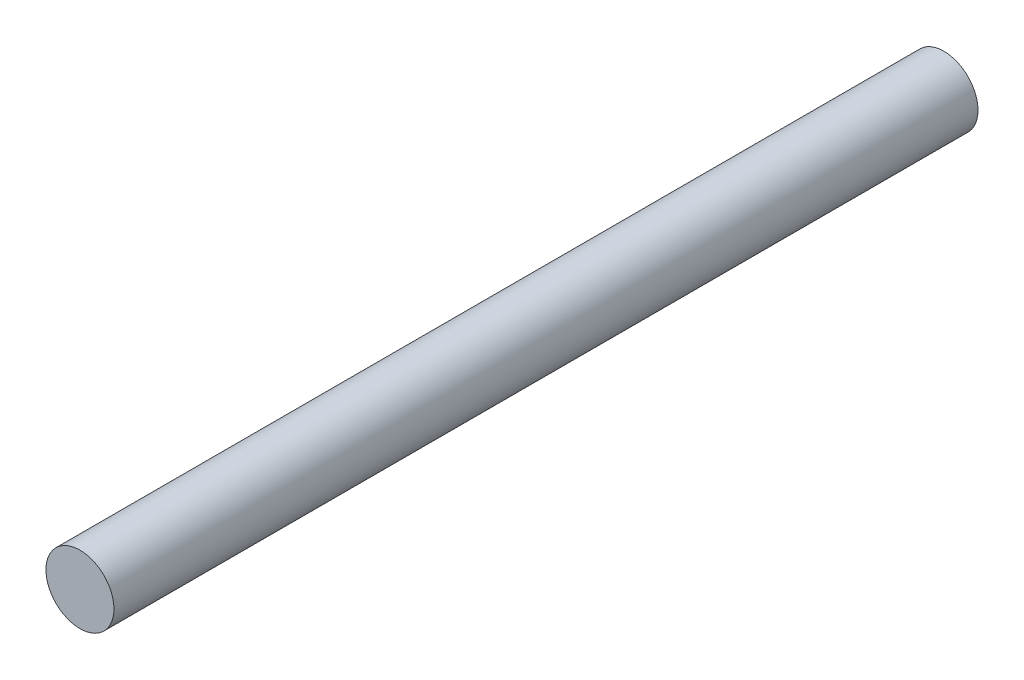
ISO-10303-21;
HEADER;
FILE_DESCRIPTION(('STEP AP214'),'2;1');
FILE_NAME('part.step','',(''),(''),'','','');
FILE_SCHEMA(('AUTOMOTIVE_DESIGN { 1 0 10303 214 1 1 1 1 }'));
ENDSEC;
DATA;
#1=APPLICATION_CONTEXT('core data for automotive mechanical design processes');
#2=APPLICATION_PROTOCOL_DEFINITION('international standard','automotive_design',2000,#1);
#3=PRODUCT_CONTEXT('',#1,'mechanical');
#4=PRODUCT('Part','Part','',(#3));
#5=PRODUCT_RELATED_PRODUCT_CATEGORY('part','',(#4));
#6=PRODUCT_DEFINITION_FORMATION('','',#4);
#7=PRODUCT_DEFINITION_CONTEXT('part definition',#1,'design');
#8=PRODUCT_DEFINITION('design','',#6,#7);
#9=PRODUCT_DEFINITION_SHAPE('','',#8);
#10=(LENGTH_UNIT() NAMED_UNIT(*) SI_UNIT(.MILLI.,.METRE.));
#11=(NAMED_UNIT(*) PLANE_ANGLE_UNIT() SI_UNIT($,.RADIAN.));
#12=(NAMED_UNIT(*) SI_UNIT($,.STERADIAN.) SOLID_ANGLE_UNIT());
#13=UNCERTAINTY_MEASURE_WITH_UNIT(LENGTH_MEASURE(1.E-05),#10,'distance_accuracy_value','');
#14=(GEOMETRIC_REPRESENTATION_CONTEXT(3) GLOBAL_UNCERTAINTY_ASSIGNED_CONTEXT((#13)) GLOBAL_UNIT_ASSIGNED_CONTEXT((#10,
#11,#12)) REPRESENTATION_CONTEXT('',''));
#15=CARTESIAN_POINT('',(0.,0.,0.));
#16=DIRECTION('',(0.,0.,1.));
#17=DIRECTION('',(1.,0.,0.));
#18=AXIS2_PLACEMENT_3D('',#15,#16,#17);
#19=CARTESIAN_POINT('',(0.,0.,190.5));
#20=DIRECTION('',(0.,0.,-1.));
#21=DIRECTION('',(-1.,0.,0.));
#22=AXIS2_PLACEMENT_3D('',#19,#20,#21);
#23=CYLINDRICAL_SURFACE('',#22,4.);
#24=CARTESIAN_POINT('',(0.,0.,190.5));
#25=DIRECTION('',(0.,0.,1.));
#26=DIRECTION('',(1.,0.,0.));
#27=AXIS2_PLACEMENT_3D('',#24,#25,#26);
#28=CIRCLE('',#27,4.);
#29=CARTESIAN_POINT('',(4.,0.,190.5));
#30=VERTEX_POINT('',#29);
#31=EDGE_CURVE('E10',#30,#30,#28,.T.);
#32=ORIENTED_EDGE('',*,*,#31,.F.);
#33=EDGE_LOOP('',(#32));
#34=FACE_BOUND('',#33,.T.);
#35=CARTESIAN_POINT('',(0.,0.,88.9));
#36=DIRECTION('',(0.,0.,1.));
#37=DIRECTION('',(1.,0.,0.));
#38=AXIS2_PLACEMENT_3D('',#35,#36,#37);
#39=CIRCLE('',#38,4.);
#40=CARTESIAN_POINT('',(4.,0.,88.9));
#41=VERTEX_POINT('',#40);
#42=EDGE_CURVE('E33',#41,#41,#39,.T.);
#43=ORIENTED_EDGE('',*,*,#42,.T.);
#44=EDGE_LOOP('',(#43));
#45=FACE_BOUND('',#44,.T.);
#46=ADVANCED_FACE('F30',(#34,#45),#23,.T.);
#47=CARTESIAN_POINT('',(0.,0.,190.5));
#48=DIRECTION('',(0.,0.,1.));
#49=DIRECTION('',(1.,0.,0.));
#50=AXIS2_PLACEMENT_3D('',#47,#48,#49);
#51=PLANE('',#50);
#52=ORIENTED_EDGE('',*,*,#31,.T.);
#53=EDGE_LOOP('',(#52));
#54=FACE_BOUND('',#53,.T.);
#55=ADVANCED_FACE('F45',(#54),#51,.T.);
#56=CARTESIAN_POINT('',(0.,0.,88.9));
#57=DIRECTION('',(0.,0.,1.));
#58=DIRECTION('',(1.,0.,0.));
#59=AXIS2_PLACEMENT_3D('',#56,#57,#58);
#60=PLANE('',#59);
#61=ORIENTED_EDGE('',*,*,#42,.F.);
#62=EDGE_LOOP('',(#61));
#63=FACE_BOUND('',#62,.T.);
#64=ADVANCED_FACE('F43',(#63),#60,.F.);
#65=CLOSED_SHELL('',(#46,#55,#64));
#66=MANIFOLD_SOLID_BREP('B2',#65);
#67=ADVANCED_BREP_SHAPE_REPRESENTATION('',(#18,#66),#14);
#68=SHAPE_DEFINITION_REPRESENTATION(#9,#67);
ENDSEC;
END-ISO-10303-21;
